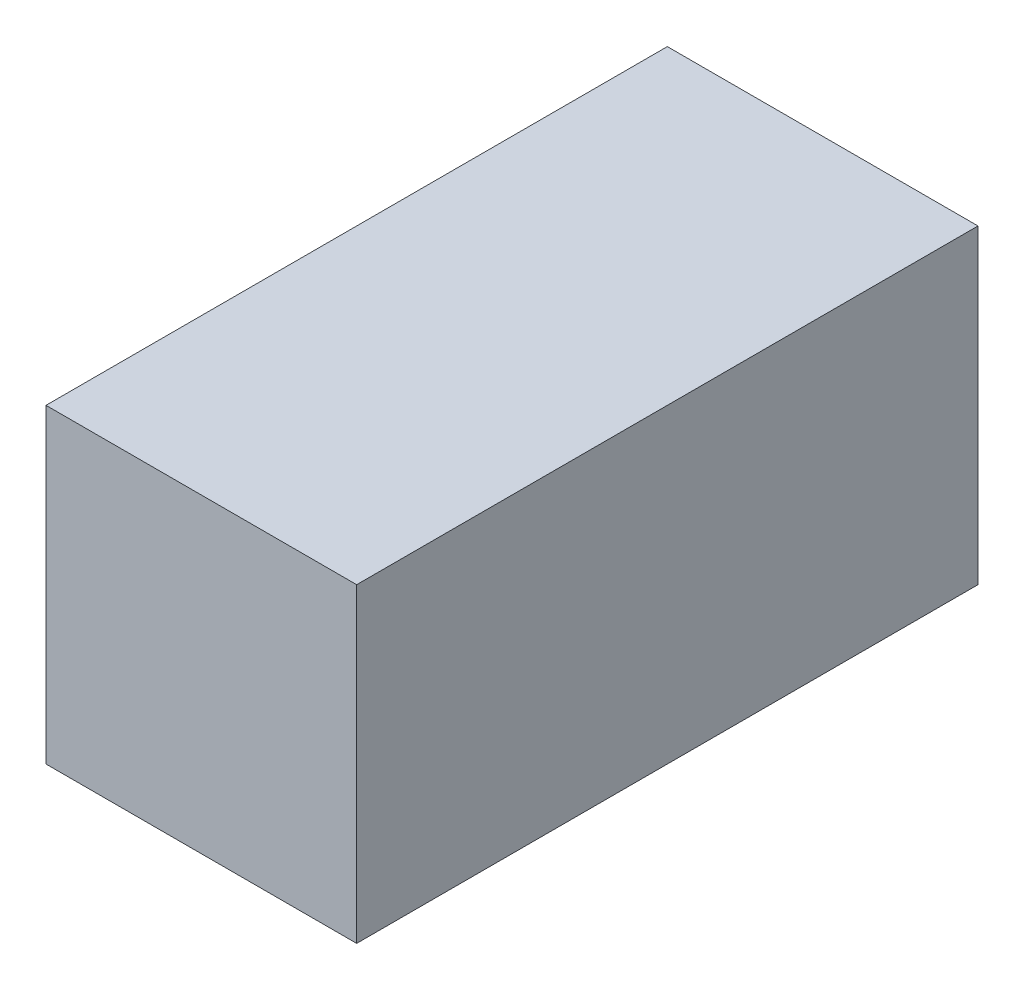
ISO-10303-21;
HEADER;
FILE_DESCRIPTION(('STEP AP214'),'2;1');
FILE_NAME('part.step','',(''),(''),'','','');
FILE_SCHEMA(('AUTOMOTIVE_DESIGN { 1 0 10303 214 1 1 1 1 }'));
ENDSEC;
DATA;
#1=APPLICATION_CONTEXT('core data for automotive mechanical design processes');
#2=APPLICATION_PROTOCOL_DEFINITION('international standard','automotive_design',2000,#1);
#3=PRODUCT_CONTEXT('',#1,'mechanical');
#4=PRODUCT('Part','Part','',(#3));
#5=PRODUCT_RELATED_PRODUCT_CATEGORY('part','',(#4));
#6=PRODUCT_DEFINITION_FORMATION('','',#4);
#7=PRODUCT_DEFINITION_CONTEXT('part definition',#1,'design');
#8=PRODUCT_DEFINITION('design','',#6,#7);
#9=PRODUCT_DEFINITION_SHAPE('','',#8);
#10=(LENGTH_UNIT() NAMED_UNIT(*) SI_UNIT(.MILLI.,.METRE.));
#11=(NAMED_UNIT(*) PLANE_ANGLE_UNIT() SI_UNIT($,.RADIAN.));
#12=(NAMED_UNIT(*) SI_UNIT($,.STERADIAN.) SOLID_ANGLE_UNIT());
#13=UNCERTAINTY_MEASURE_WITH_UNIT(LENGTH_MEASURE(1.E-05),#10,'distance_accuracy_value','');
#14=(GEOMETRIC_REPRESENTATION_CONTEXT(3) GLOBAL_UNCERTAINTY_ASSIGNED_CONTEXT((#13)) GLOBAL_UNIT_ASSIGNED_CONTEXT((#10,
#11,#12)) REPRESENTATION_CONTEXT('',''));
#15=CARTESIAN_POINT('',(0.,0.,0.));
#16=DIRECTION('',(0.,0.,1.));
#17=DIRECTION('',(1.,0.,0.));
#18=AXIS2_PLACEMENT_3D('',#15,#16,#17);
#19=CARTESIAN_POINT('',(37.5,-37.5,150.));
#20=DIRECTION('',(-1.,0.,0.));
#21=DIRECTION('',(0.,0.,1.));
#22=AXIS2_PLACEMENT_3D('',#19,#20,#21);
#23=PLANE('',#22);
#24=DIRECTION('',(0.,1.,0.));
#25=VECTOR('',#24,1.);
#26=CARTESIAN_POINT('',(37.5,-37.5,0.));
#27=LINE('',#26,#25);
#28=CARTESIAN_POINT('',(37.5,-37.5,0.));
#29=VERTEX_POINT('',#28);
#30=CARTESIAN_POINT('',(37.5,37.5,0.));
#31=VERTEX_POINT('',#30);
#32=EDGE_CURVE('E96',#29,#31,#27,.T.);
#33=ORIENTED_EDGE('',*,*,#32,.T.);
#34=DIRECTION('',(0.,0.,-1.));
#35=VECTOR('',#34,1.);
#36=CARTESIAN_POINT('',(37.5,37.5,150.));
#37=LINE('',#36,#35);
#38=CARTESIAN_POINT('',(37.5,37.5,150.));
#39=VERTEX_POINT('',#38);
#40=EDGE_CURVE('E11',#39,#31,#37,.T.);
#41=ORIENTED_EDGE('',*,*,#40,.F.);
#42=DIRECTION('',(0.,1.,0.));
#43=VECTOR('',#42,1.);
#44=CARTESIAN_POINT('',(37.5,-37.5,150.));
#45=LINE('',#44,#43);
#46=CARTESIAN_POINT('',(37.5,-37.5,150.));
#47=VERTEX_POINT('',#46);
#48=EDGE_CURVE('E84',#47,#39,#45,.T.);
#49=ORIENTED_EDGE('',*,*,#48,.F.);
#50=DIRECTION('',(0.,0.,-1.));
#51=VECTOR('',#50,1.);
#52=CARTESIAN_POINT('',(37.5,-37.5,150.));
#53=LINE('',#52,#51);
#54=EDGE_CURVE('E92',#47,#29,#53,.T.);
#55=ORIENTED_EDGE('',*,*,#54,.T.);
#56=EDGE_LOOP('',(#33,#41,#49,#55));
#57=FACE_BOUND('',#56,.T.);
#58=ADVANCED_FACE('F33',(#57),#23,.F.);
#59=CARTESIAN_POINT('',(-37.5,37.5,150.));
#60=DIRECTION('',(0.,-1.,0.));
#61=DIRECTION('',(0.,0.,-1.));
#62=AXIS2_PLACEMENT_3D('',#59,#60,#61);
#63=PLANE('',#62);
#64=DIRECTION('',(-1.,0.,0.));
#65=VECTOR('',#64,1.);
#66=CARTESIAN_POINT('',(-37.5,37.5,0.));
#67=LINE('',#66,#65);
#68=CARTESIAN_POINT('',(-37.5,37.5,0.));
#69=VERTEX_POINT('',#68);
#70=EDGE_CURVE('E88',#31,#69,#67,.T.);
#71=ORIENTED_EDGE('',*,*,#70,.T.);
#72=DIRECTION('',(0.,0.,-1.));
#73=VECTOR('',#72,1.);
#74=CARTESIAN_POINT('',(-37.5,37.5,150.));
#75=LINE('',#74,#73);
#76=CARTESIAN_POINT('',(-37.5,37.5,150.));
#77=VERTEX_POINT('',#76);
#78=EDGE_CURVE('E41',#77,#69,#75,.T.);
#79=ORIENTED_EDGE('',*,*,#78,.F.);
#80=DIRECTION('',(-1.,0.,0.));
#81=VECTOR('',#80,1.);
#82=CARTESIAN_POINT('',(-37.5,37.5,150.));
#83=LINE('',#82,#81);
#84=EDGE_CURVE('E79',#39,#77,#83,.T.);
#85=ORIENTED_EDGE('',*,*,#84,.F.);
#86=ORIENTED_EDGE('',*,*,#40,.T.);
#87=EDGE_LOOP('',(#71,#79,#85,#86));
#88=FACE_BOUND('',#87,.T.);
#89=ADVANCED_FACE('F87',(#88),#63,.F.);
#90=CARTESIAN_POINT('',(-37.5,-37.5,150.));
#91=DIRECTION('',(1.,0.,0.));
#92=DIRECTION('',(0.,0.,-1.));
#93=AXIS2_PLACEMENT_3D('',#90,#91,#92);
#94=PLANE('',#93);
#95=DIRECTION('',(0.,-1.,0.));
#96=VECTOR('',#95,1.);
#97=CARTESIAN_POINT('',(-37.5,-37.5,0.));
#98=LINE('',#97,#96);
#99=CARTESIAN_POINT('',(-37.5,-37.5,0.));
#100=VERTEX_POINT('',#99);
#101=EDGE_CURVE('E66',#69,#100,#98,.T.);
#102=ORIENTED_EDGE('',*,*,#101,.T.);
#103=DIRECTION('',(0.,0.,-1.));
#104=VECTOR('',#103,1.);
#105=CARTESIAN_POINT('',(-37.5,-37.5,150.));
#106=LINE('',#105,#104);
#107=CARTESIAN_POINT('',(-37.5,-37.5,150.));
#108=VERTEX_POINT('',#107);
#109=EDGE_CURVE('E89',#108,#100,#106,.T.);
#110=ORIENTED_EDGE('',*,*,#109,.F.);
#111=DIRECTION('',(0.,-1.,0.));
#112=VECTOR('',#111,1.);
#113=CARTESIAN_POINT('',(-37.5,-37.5,150.));
#114=LINE('',#113,#112);
#115=EDGE_CURVE('E82',#77,#108,#114,.T.);
#116=ORIENTED_EDGE('',*,*,#115,.F.);
#117=ORIENTED_EDGE('',*,*,#78,.T.);
#118=EDGE_LOOP('',(#102,#110,#116,#117));
#119=FACE_BOUND('',#118,.T.);
#120=ADVANCED_FACE('F90',(#119),#94,.F.);
#121=CARTESIAN_POINT('',(-37.5,-37.5,150.));
#122=DIRECTION('',(0.,1.,0.));
#123=DIRECTION('',(0.,0.,1.));
#124=AXIS2_PLACEMENT_3D('',#121,#122,#123);
#125=PLANE('',#124);
#126=DIRECTION('',(1.,0.,0.));
#127=VECTOR('',#126,1.);
#128=CARTESIAN_POINT('',(-37.5,-37.5,0.));
#129=LINE('',#128,#127);
#130=EDGE_CURVE('E72',#100,#29,#129,.T.);
#131=ORIENTED_EDGE('',*,*,#130,.T.);
#132=ORIENTED_EDGE('',*,*,#54,.F.);
#133=DIRECTION('',(1.,0.,0.));
#134=VECTOR('',#133,1.);
#135=CARTESIAN_POINT('',(-37.5,-37.5,150.));
#136=LINE('',#135,#134);
#137=EDGE_CURVE('E49',#108,#47,#136,.T.);
#138=ORIENTED_EDGE('',*,*,#137,.F.);
#139=ORIENTED_EDGE('',*,*,#109,.T.);
#140=EDGE_LOOP('',(#131,#132,#138,#139));
#141=FACE_BOUND('',#140,.T.);
#142=ADVANCED_FACE('F103',(#141),#125,.F.);
#143=CARTESIAN_POINT('',(0.,0.,150.));
#144=DIRECTION('',(0.,0.,-1.));
#145=DIRECTION('',(-1.,0.,0.));
#146=AXIS2_PLACEMENT_3D('',#143,#144,#145);
#147=PLANE('',#146);
#148=ORIENTED_EDGE('',*,*,#48,.T.);
#149=ORIENTED_EDGE('',*,*,#84,.T.);
#150=ORIENTED_EDGE('',*,*,#115,.T.);
#151=ORIENTED_EDGE('',*,*,#137,.T.);
#152=EDGE_LOOP('',(#148,#149,#150,#151));
#153=FACE_BOUND('',#152,.T.);
#154=ADVANCED_FACE('F80',(#153),#147,.F.);
#155=CARTESIAN_POINT('',(0.,0.,0.));
#156=DIRECTION('',(0.,0.,-1.));
#157=DIRECTION('',(-1.,0.,0.));
#158=AXIS2_PLACEMENT_3D('',#155,#156,#157);
#159=PLANE('',#158);
#160=ORIENTED_EDGE('',*,*,#32,.F.);
#161=ORIENTED_EDGE('',*,*,#130,.F.);
#162=ORIENTED_EDGE('',*,*,#101,.F.);
#163=ORIENTED_EDGE('',*,*,#70,.F.);
#164=EDGE_LOOP('',(#160,#161,#162,#163));
#165=FACE_BOUND('',#164,.T.);
#166=ADVANCED_FACE('F106',(#165),#159,.T.);
#167=CLOSED_SHELL('',(#58,#89,#120,#142,#154,#166));
#168=MANIFOLD_SOLID_BREP('B2',#167);
#169=ADVANCED_BREP_SHAPE_REPRESENTATION('',(#18,#168),#14);
#170=SHAPE_DEFINITION_REPRESENTATION(#9,#169);
ENDSEC;
END-ISO-10303-21;
